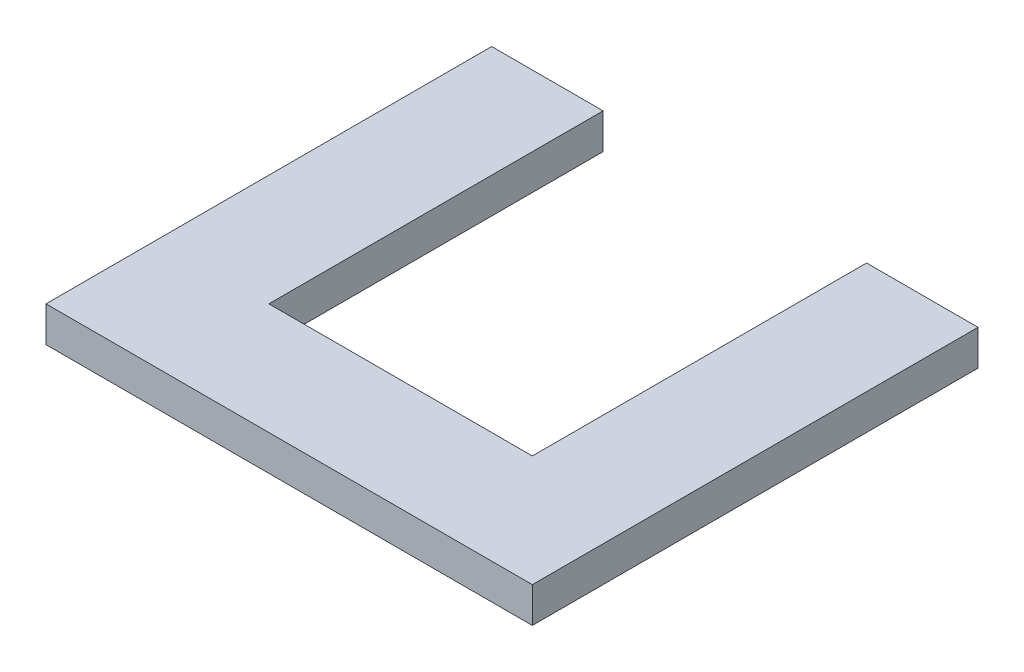
ISO-10303-21;
HEADER;
FILE_DESCRIPTION(('STEP AP214'),'2;1');
FILE_NAME('part.step','',(''),(''),'','','');
FILE_SCHEMA(('AUTOMOTIVE_DESIGN { 1 0 10303 214 1 1 1 1 }'));
ENDSEC;
DATA;
#1=APPLICATION_CONTEXT('core data for automotive mechanical design processes');
#2=APPLICATION_PROTOCOL_DEFINITION('international standard','automotive_design',2000,#1);
#3=PRODUCT_CONTEXT('',#1,'mechanical');
#4=PRODUCT('Part','Part','',(#3));
#5=PRODUCT_RELATED_PRODUCT_CATEGORY('part','',(#4));
#6=PRODUCT_DEFINITION_FORMATION('','',#4);
#7=PRODUCT_DEFINITION_CONTEXT('part definition',#1,'design');
#8=PRODUCT_DEFINITION('design','',#6,#7);
#9=PRODUCT_DEFINITION_SHAPE('','',#8);
#10=(LENGTH_UNIT() NAMED_UNIT(*) SI_UNIT(.MILLI.,.METRE.));
#11=(NAMED_UNIT(*) PLANE_ANGLE_UNIT() SI_UNIT($,.RADIAN.));
#12=(NAMED_UNIT(*) SI_UNIT($,.STERADIAN.) SOLID_ANGLE_UNIT());
#13=UNCERTAINTY_MEASURE_WITH_UNIT(LENGTH_MEASURE(1.E-05),#10,'distance_accuracy_value','');
#14=(GEOMETRIC_REPRESENTATION_CONTEXT(3) GLOBAL_UNCERTAINTY_ASSIGNED_CONTEXT((#13)) GLOBAL_UNIT_ASSIGNED_CONTEXT((#10,
#11,#12)) REPRESENTATION_CONTEXT('',''));
#15=CARTESIAN_POINT('',(0.,0.,0.));
#16=DIRECTION('',(0.,0.,1.));
#17=DIRECTION('',(1.,0.,0.));
#18=AXIS2_PLACEMENT_3D('',#15,#16,#17);
#19=CARTESIAN_POINT('',(0.,6.35,-80.));
#20=DIRECTION('',(0.,0.,-1.));
#21=DIRECTION('',(-1.,0.,0.));
#22=AXIS2_PLACEMENT_3D('',#19,#20,#21);
#23=PLANE('',#22);
#24=DIRECTION('',(1.,0.,0.));
#25=VECTOR('',#24,1.);
#26=CARTESIAN_POINT('',(0.,0.,-80.));
#27=LINE('',#26,#25);
#28=CARTESIAN_POINT('',(67.3,0.,-80.));
#29=VERTEX_POINT('',#28);
#30=CARTESIAN_POINT('',(87.3,0.,-80.));
#31=VERTEX_POINT('',#30);
#32=EDGE_CURVE('E145',#29,#31,#27,.T.);
#33=ORIENTED_EDGE('',*,*,#32,.F.);
#34=DIRECTION('',(0.,-1.,0.));
#35=VECTOR('',#34,1.);
#36=CARTESIAN_POINT('',(67.3,6.35,-80.));
#37=LINE('',#36,#35);
#38=CARTESIAN_POINT('',(67.3,6.35,-80.));
#39=VERTEX_POINT('',#38);
#40=EDGE_CURVE('E11',#39,#29,#37,.T.);
#41=ORIENTED_EDGE('',*,*,#40,.F.);
#42=DIRECTION('',(1.,0.,0.));
#43=VECTOR('',#42,1.);
#44=CARTESIAN_POINT('',(0.,6.35,-80.));
#45=LINE('',#44,#43);
#46=CARTESIAN_POINT('',(87.3,6.35,-80.));
#47=VERTEX_POINT('',#46);
#48=EDGE_CURVE('E139',#39,#47,#45,.T.);
#49=ORIENTED_EDGE('',*,*,#48,.T.);
#50=DIRECTION('',(0.,-1.,0.));
#51=VECTOR('',#50,1.);
#52=CARTESIAN_POINT('',(87.3,6.35,-80.));
#53=LINE('',#52,#51);
#54=EDGE_CURVE('E93',#47,#31,#53,.T.);
#55=ORIENTED_EDGE('',*,*,#54,.T.);
#56=EDGE_LOOP('',(#33,#41,#49,#55));
#57=FACE_BOUND('',#56,.T.);
#58=ADVANCED_FACE('F41',(#57),#23,.T.);
#59=CARTESIAN_POINT('',(67.3,6.35,0.));
#60=DIRECTION('',(1.,0.,0.));
#61=DIRECTION('',(0.,0.,-1.));
#62=AXIS2_PLACEMENT_3D('',#59,#60,#61);
#63=PLANE('',#62);
#64=DIRECTION('',(0.,0.,1.));
#65=VECTOR('',#64,1.);
#66=CARTESIAN_POINT('',(67.3,0.,0.));
#67=LINE('',#66,#65);
#68=CARTESIAN_POINT('',(67.3,0.,-20.0000000000001));
#69=VERTEX_POINT('',#68);
#70=EDGE_CURVE('E149',#29,#69,#67,.T.);
#71=ORIENTED_EDGE('',*,*,#70,.T.);
#72=DIRECTION('',(0.,-1.,0.));
#73=VECTOR('',#72,1.);
#74=CARTESIAN_POINT('',(67.3,6.35,-20.0000000000001));
#75=LINE('',#74,#73);
#76=CARTESIAN_POINT('',(67.3,6.35,-20.0000000000001));
#77=VERTEX_POINT('',#76);
#78=EDGE_CURVE('E51',#77,#69,#75,.T.);
#79=ORIENTED_EDGE('',*,*,#78,.F.);
#80=DIRECTION('',(0.,0.,1.));
#81=VECTOR('',#80,1.);
#82=CARTESIAN_POINT('',(67.3,6.35,0.));
#83=LINE('',#82,#81);
#84=EDGE_CURVE('E198',#39,#77,#83,.T.);
#85=ORIENTED_EDGE('',*,*,#84,.F.);
#86=ORIENTED_EDGE('',*,*,#40,.T.);
#87=EDGE_LOOP('',(#71,#79,#85,#86));
#88=FACE_BOUND('',#87,.T.);
#89=ADVANCED_FACE('F43',(#88),#63,.F.);
#90=CARTESIAN_POINT('',(0.,6.35,-20.0000000000001));
#91=DIRECTION('',(0.,0.,-1.));
#92=DIRECTION('',(-1.,0.,0.));
#93=AXIS2_PLACEMENT_3D('',#90,#91,#92);
#94=PLANE('',#93);
#95=DIRECTION('',(1.,0.,0.));
#96=VECTOR('',#95,1.);
#97=CARTESIAN_POINT('',(0.,0.,-20.0000000000001));
#98=LINE('',#97,#96);
#99=CARTESIAN_POINT('',(20.,0.,-20.0000000000001));
#100=VERTEX_POINT('',#99);
#101=EDGE_CURVE('E154',#100,#69,#98,.T.);
#102=ORIENTED_EDGE('',*,*,#101,.F.);
#103=DIRECTION('',(0.,-1.,0.));
#104=VECTOR('',#103,1.);
#105=CARTESIAN_POINT('',(20.,6.35,-20.0000000000001));
#106=LINE('',#105,#104);
#107=CARTESIAN_POINT('',(20.,6.35,-20.0000000000001));
#108=VERTEX_POINT('',#107);
#109=EDGE_CURVE('E178',#108,#100,#106,.T.);
#110=ORIENTED_EDGE('',*,*,#109,.F.);
#111=DIRECTION('',(1.,0.,0.));
#112=VECTOR('',#111,1.);
#113=CARTESIAN_POINT('',(0.,6.35,-20.0000000000001));
#114=LINE('',#113,#112);
#115=EDGE_CURVE('E187',#108,#77,#114,.T.);
#116=ORIENTED_EDGE('',*,*,#115,.T.);
#117=ORIENTED_EDGE('',*,*,#78,.T.);
#118=EDGE_LOOP('',(#102,#110,#116,#117));
#119=FACE_BOUND('',#118,.T.);
#120=ADVANCED_FACE('F185',(#119),#94,.T.);
#121=CARTESIAN_POINT('',(20.,6.35,0.));
#122=DIRECTION('',(1.,0.,0.));
#123=DIRECTION('',(0.,0.,-1.));
#124=AXIS2_PLACEMENT_3D('',#121,#122,#123);
#125=PLANE('',#124);
#126=DIRECTION('',(0.,0.,1.));
#127=VECTOR('',#126,1.);
#128=CARTESIAN_POINT('',(20.,0.,0.));
#129=LINE('',#128,#127);
#130=CARTESIAN_POINT('',(20.,0.,-80.));
#131=VERTEX_POINT('',#130);
#132=EDGE_CURVE('E158',#131,#100,#129,.T.);
#133=ORIENTED_EDGE('',*,*,#132,.F.);
#134=DIRECTION('',(0.,-1.,0.));
#135=VECTOR('',#134,1.);
#136=CARTESIAN_POINT('',(20.,6.35,-80.));
#137=LINE('',#136,#135);
#138=CARTESIAN_POINT('',(20.,6.35,-80.));
#139=VERTEX_POINT('',#138);
#140=EDGE_CURVE('E175',#139,#131,#137,.T.);
#141=ORIENTED_EDGE('',*,*,#140,.F.);
#142=DIRECTION('',(0.,0.,1.));
#143=VECTOR('',#142,1.);
#144=CARTESIAN_POINT('',(20.,6.35,0.));
#145=LINE('',#144,#143);
#146=EDGE_CURVE('E137',#139,#108,#145,.T.);
#147=ORIENTED_EDGE('',*,*,#146,.T.);
#148=ORIENTED_EDGE('',*,*,#109,.T.);
#149=EDGE_LOOP('',(#133,#141,#147,#148));
#150=FACE_BOUND('',#149,.T.);
#151=ADVANCED_FACE('F196',(#150),#125,.T.);
#152=CARTESIAN_POINT('',(0.,0.,-80.));
#153=VERTEX_POINT('',#152);
#154=EDGE_CURVE('E150',#153,#131,#27,.T.);
#155=ORIENTED_EDGE('',*,*,#154,.F.);
#156=DIRECTION('',(0.,-1.,0.));
#157=VECTOR('',#156,1.);
#158=CARTESIAN_POINT('',(0.,6.35,-80.));
#159=LINE('',#158,#157);
#160=CARTESIAN_POINT('',(0.,6.35,-80.));
#161=VERTEX_POINT('',#160);
#162=EDGE_CURVE('E122',#161,#153,#159,.T.);
#163=ORIENTED_EDGE('',*,*,#162,.F.);
#164=EDGE_CURVE('E133',#161,#139,#45,.T.);
#165=ORIENTED_EDGE('',*,*,#164,.T.);
#166=ORIENTED_EDGE('',*,*,#140,.T.);
#167=EDGE_LOOP('',(#155,#163,#165,#166));
#168=FACE_BOUND('',#167,.T.);
#169=ADVANCED_FACE('F206',(#168),#23,.T.);
#170=CARTESIAN_POINT('',(0.,6.35,0.));
#171=DIRECTION('',(-1.,0.,0.));
#172=DIRECTION('',(0.,0.,1.));
#173=AXIS2_PLACEMENT_3D('',#170,#171,#172);
#174=PLANE('',#173);
#175=DIRECTION('',(0.,0.,-1.));
#176=VECTOR('',#175,1.);
#177=CARTESIAN_POINT('',(0.,0.,0.));
#178=LINE('',#177,#176);
#179=CARTESIAN_POINT('',(0.,0.,0.));
#180=VERTEX_POINT('',#179);
#181=EDGE_CURVE('E120',#180,#153,#178,.T.);
#182=ORIENTED_EDGE('',*,*,#181,.F.);
#183=DIRECTION('',(0.,-1.,0.));
#184=VECTOR('',#183,1.);
#185=CARTESIAN_POINT('',(0.,6.35,0.));
#186=LINE('',#185,#184);
#187=CARTESIAN_POINT('',(0.,6.35,0.));
#188=VERTEX_POINT('',#187);
#189=EDGE_CURVE('E114',#188,#180,#186,.T.);
#190=ORIENTED_EDGE('',*,*,#189,.F.);
#191=DIRECTION('',(0.,0.,-1.));
#192=VECTOR('',#191,1.);
#193=CARTESIAN_POINT('',(0.,6.35,0.));
#194=LINE('',#193,#192);
#195=EDGE_CURVE('E118',#188,#161,#194,.T.);
#196=ORIENTED_EDGE('',*,*,#195,.T.);
#197=ORIENTED_EDGE('',*,*,#162,.T.);
#198=EDGE_LOOP('',(#182,#190,#196,#197));
#199=FACE_BOUND('',#198,.T.);
#200=ADVANCED_FACE('F116',(#199),#174,.T.);
#201=CARTESIAN_POINT('',(0.,6.35,0.));
#202=DIRECTION('',(0.,0.,-1.));
#203=DIRECTION('',(-1.,0.,0.));
#204=AXIS2_PLACEMENT_3D('',#201,#202,#203);
#205=PLANE('',#204);
#206=DIRECTION('',(1.,0.,0.));
#207=VECTOR('',#206,1.);
#208=CARTESIAN_POINT('',(0.,0.,0.));
#209=LINE('',#208,#207);
#210=CARTESIAN_POINT('',(87.3,0.,0.));
#211=VERTEX_POINT('',#210);
#212=EDGE_CURVE('E86',#180,#211,#209,.T.);
#213=ORIENTED_EDGE('',*,*,#212,.T.);
#214=DIRECTION('',(0.,-1.,0.));
#215=VECTOR('',#214,1.);
#216=CARTESIAN_POINT('',(87.3,6.35,0.));
#217=LINE('',#216,#215);
#218=CARTESIAN_POINT('',(87.3,6.35,0.));
#219=VERTEX_POINT('',#218);
#220=EDGE_CURVE('E123',#219,#211,#217,.T.);
#221=ORIENTED_EDGE('',*,*,#220,.F.);
#222=DIRECTION('',(1.,0.,0.));
#223=VECTOR('',#222,1.);
#224=CARTESIAN_POINT('',(0.,6.35,0.));
#225=LINE('',#224,#223);
#226=EDGE_CURVE('E125',#188,#219,#225,.T.);
#227=ORIENTED_EDGE('',*,*,#226,.F.);
#228=ORIENTED_EDGE('',*,*,#189,.T.);
#229=EDGE_LOOP('',(#213,#221,#227,#228));
#230=FACE_BOUND('',#229,.T.);
#231=ADVANCED_FACE('F126',(#230),#205,.F.);
#232=CARTESIAN_POINT('',(87.3,6.35,0.));
#233=DIRECTION('',(-1.,0.,0.));
#234=DIRECTION('',(0.,0.,1.));
#235=AXIS2_PLACEMENT_3D('',#232,#233,#234);
#236=PLANE('',#235);
#237=DIRECTION('',(0.,0.,-1.));
#238=VECTOR('',#237,1.);
#239=CARTESIAN_POINT('',(87.3,0.,0.));
#240=LINE('',#239,#238);
#241=EDGE_CURVE('E166',#211,#31,#240,.T.);
#242=ORIENTED_EDGE('',*,*,#241,.T.);
#243=ORIENTED_EDGE('',*,*,#54,.F.);
#244=DIRECTION('',(0.,0.,-1.));
#245=VECTOR('',#244,1.);
#246=CARTESIAN_POINT('',(87.3,6.35,0.));
#247=LINE('',#246,#245);
#248=EDGE_CURVE('E59',#219,#47,#247,.T.);
#249=ORIENTED_EDGE('',*,*,#248,.F.);
#250=ORIENTED_EDGE('',*,*,#220,.T.);
#251=EDGE_LOOP('',(#242,#243,#249,#250));
#252=FACE_BOUND('',#251,.T.);
#253=ADVANCED_FACE('F221',(#252),#236,.F.);
#254=CARTESIAN_POINT('',(0.,6.35,0.));
#255=DIRECTION('',(0.,1.,0.));
#256=DIRECTION('',(0.,0.,1.));
#257=AXIS2_PLACEMENT_3D('',#254,#255,#256);
#258=PLANE('',#257);
#259=ORIENTED_EDGE('',*,*,#48,.F.);
#260=ORIENTED_EDGE('',*,*,#84,.T.);
#261=ORIENTED_EDGE('',*,*,#115,.F.);
#262=ORIENTED_EDGE('',*,*,#146,.F.);
#263=ORIENTED_EDGE('',*,*,#164,.F.);
#264=ORIENTED_EDGE('',*,*,#195,.F.);
#265=ORIENTED_EDGE('',*,*,#226,.T.);
#266=ORIENTED_EDGE('',*,*,#248,.T.);
#267=EDGE_LOOP('',(#259,#260,#261,#262,#263,#264,#265,#266));
#268=FACE_BOUND('',#267,.T.);
#269=ADVANCED_FACE('F130',(#268),#258,.T.);
#270=CARTESIAN_POINT('',(0.,0.,0.));
#271=DIRECTION('',(0.,1.,0.));
#272=DIRECTION('',(0.,0.,1.));
#273=AXIS2_PLACEMENT_3D('',#270,#271,#272);
#274=PLANE('',#273);
#275=ORIENTED_EDGE('',*,*,#32,.T.);
#276=ORIENTED_EDGE('',*,*,#241,.F.);
#277=ORIENTED_EDGE('',*,*,#212,.F.);
#278=ORIENTED_EDGE('',*,*,#181,.T.);
#279=ORIENTED_EDGE('',*,*,#154,.T.);
#280=ORIENTED_EDGE('',*,*,#132,.T.);
#281=ORIENTED_EDGE('',*,*,#101,.T.);
#282=ORIENTED_EDGE('',*,*,#70,.F.);
#283=EDGE_LOOP('',(#275,#276,#277,#278,#279,#280,#281,#282));
#284=FACE_BOUND('',#283,.T.);
#285=ADVANCED_FACE('F191',(#284),#274,.F.);
#286=CLOSED_SHELL('',(#58,#89,#120,#151,#169,#200,#231,#253,#269,#285));
#287=MANIFOLD_SOLID_BREP('B2',#286);
#288=ADVANCED_BREP_SHAPE_REPRESENTATION('',(#18,#287),#14);
#289=SHAPE_DEFINITION_REPRESENTATION(#9,#288);
ENDSEC;
END-ISO-10303-21;
